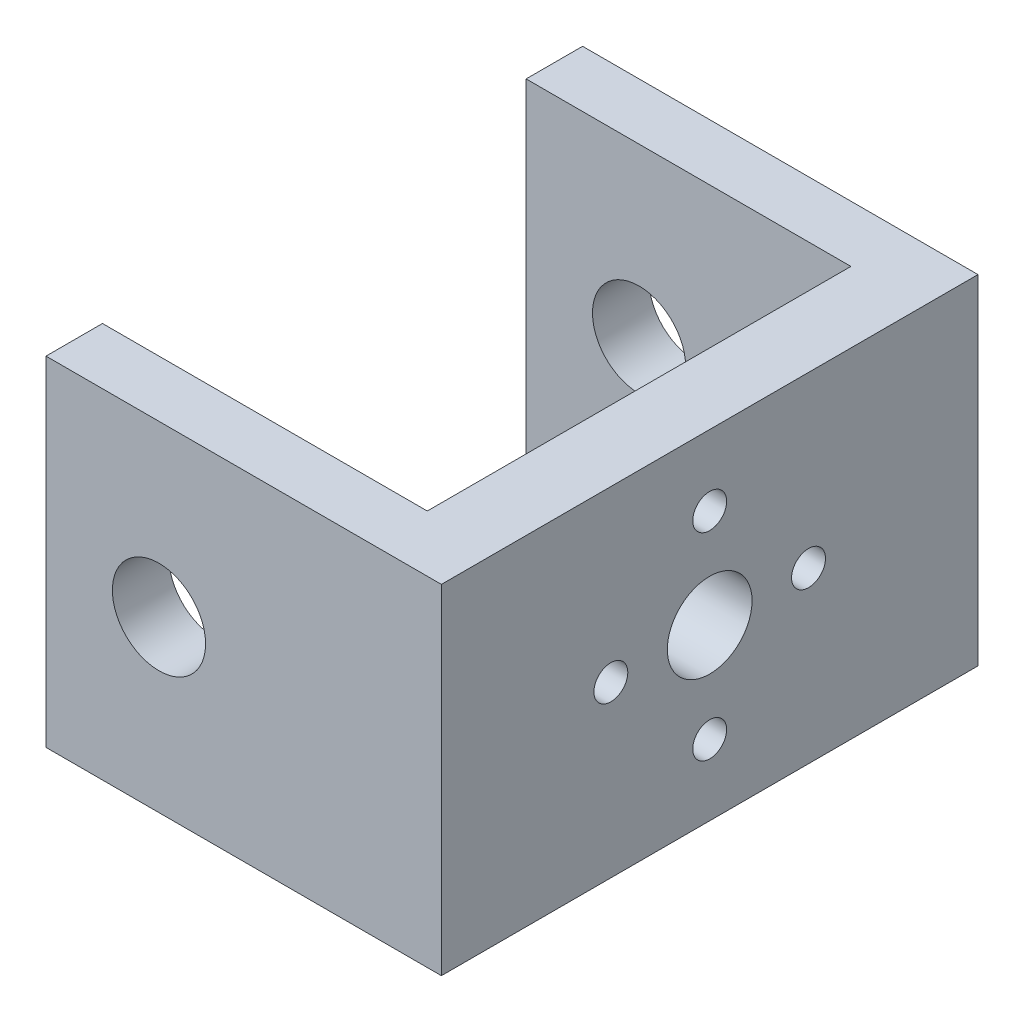
ISO-10303-21;
HEADER;
FILE_DESCRIPTION(('STEP AP214'),'2;1');
FILE_NAME('part.step','',(''),(''),'','','');
FILE_SCHEMA(('AUTOMOTIVE_DESIGN { 1 0 10303 214 1 1 1 1 }'));
ENDSEC;
DATA;
#1=APPLICATION_CONTEXT('core data for automotive mechanical design processes');
#2=APPLICATION_PROTOCOL_DEFINITION('international standard','automotive_design',2000,#1);
#3=PRODUCT_CONTEXT('',#1,'mechanical');
#4=PRODUCT('Part','Part','',(#3));
#5=PRODUCT_RELATED_PRODUCT_CATEGORY('part','',(#4));
#6=PRODUCT_DEFINITION_FORMATION('','',#4);
#7=PRODUCT_DEFINITION_CONTEXT('part definition',#1,'design');
#8=PRODUCT_DEFINITION('design','',#6,#7);
#9=PRODUCT_DEFINITION_SHAPE('','',#8);
#10=(LENGTH_UNIT() NAMED_UNIT(*) SI_UNIT(.MILLI.,.METRE.));
#11=(NAMED_UNIT(*) PLANE_ANGLE_UNIT() SI_UNIT($,.RADIAN.));
#12=(NAMED_UNIT(*) SI_UNIT($,.STERADIAN.) SOLID_ANGLE_UNIT());
#13=UNCERTAINTY_MEASURE_WITH_UNIT(LENGTH_MEASURE(1.E-05),#10,'distance_accuracy_value','');
#14=(GEOMETRIC_REPRESENTATION_CONTEXT(3) GLOBAL_UNCERTAINTY_ASSIGNED_CONTEXT((#13)) GLOBAL_UNIT_ASSIGNED_CONTEXT((#10,
#11,#12)) REPRESENTATION_CONTEXT('',''));
#15=CARTESIAN_POINT('',(0.,0.,0.));
#16=DIRECTION('',(0.,0.,1.));
#17=DIRECTION('',(1.,0.,0.));
#18=AXIS2_PLACEMENT_3D('',#15,#16,#17);
#19=CARTESIAN_POINT('',(0.,0.,-34.));
#20=DIRECTION('',(0.,0.,-1.));
#21=DIRECTION('',(-1.,0.,0.));
#22=AXIS2_PLACEMENT_3D('',#19,#20,#21);
#23=PLANE('',#22);
#24=DIRECTION('',(0.,-1.,0.));
#25=VECTOR('',#24,1.);
#26=CARTESIAN_POINT('',(0.,0.,-34.));
#27=LINE('',#26,#25);
#28=CARTESIAN_POINT('',(0.,24.,-34.));
#29=VERTEX_POINT('',#28);
#30=CARTESIAN_POINT('',(0.,0.,-34.));
#31=VERTEX_POINT('',#30);
#32=EDGE_CURVE('E139',#29,#31,#27,.T.);
#33=ORIENTED_EDGE('',*,*,#32,.F.);
#34=DIRECTION('',(-1.,0.,0.));
#35=VECTOR('',#34,1.);
#36=CARTESIAN_POINT('',(0.,24.,-34.));
#37=LINE('',#36,#35);
#38=CARTESIAN_POINT('',(28.,24.,-34.));
#39=VERTEX_POINT('',#38);
#40=EDGE_CURVE('E135',#39,#29,#37,.T.);
#41=ORIENTED_EDGE('',*,*,#40,.F.);
#42=DIRECTION('',(0.,1.,0.));
#43=VECTOR('',#42,1.);
#44=CARTESIAN_POINT('',(28.,0.,-34.));
#45=LINE('',#44,#43);
#46=CARTESIAN_POINT('',(28.,0.,-34.));
#47=VERTEX_POINT('',#46);
#48=EDGE_CURVE('E188',#47,#39,#45,.T.);
#49=ORIENTED_EDGE('',*,*,#48,.F.);
#50=DIRECTION('',(1.,0.,0.));
#51=VECTOR('',#50,1.);
#52=CARTESIAN_POINT('',(0.,0.,-34.));
#53=LINE('',#52,#51);
#54=EDGE_CURVE('E190',#31,#47,#53,.T.);
#55=ORIENTED_EDGE('',*,*,#54,.F.);
#56=EDGE_LOOP('',(#33,#41,#49,#55));
#57=FACE_BOUND('',#56,.T.);
#58=CARTESIAN_POINT('',(8.,12.,-34.));
#59=DIRECTION('',(0.,0.,1.));
#60=DIRECTION('',(1.,0.,0.));
#61=AXIS2_PLACEMENT_3D('',#58,#59,#60);
#62=CIRCLE('',#61,3.29999999999999);
#63=CARTESIAN_POINT('',(11.3,12.,-34.));
#64=VERTEX_POINT('',#63);
#65=EDGE_CURVE('E211',#64,#64,#62,.T.);
#66=ORIENTED_EDGE('',*,*,#65,.T.);
#67=EDGE_LOOP('',(#66));
#68=FACE_BOUND('',#67,.T.);
#69=ADVANCED_FACE('F39',(#57,#68),#23,.T.);
#70=CARTESIAN_POINT('',(0.,0.,4.));
#71=DIRECTION('',(1.,0.,0.));
#72=DIRECTION('',(0.,0.,-1.));
#73=AXIS2_PLACEMENT_3D('',#70,#71,#72);
#74=PLANE('',#73);
#75=DIRECTION('',(0.,-1.,0.));
#76=VECTOR('',#75,1.);
#77=CARTESIAN_POINT('',(0.,0.,0.));
#78=LINE('',#77,#76);
#79=CARTESIAN_POINT('',(0.,24.,0.));
#80=VERTEX_POINT('',#79);
#81=CARTESIAN_POINT('',(0.,0.,0.));
#82=VERTEX_POINT('',#81);
#83=EDGE_CURVE('E157',#80,#82,#78,.T.);
#84=ORIENTED_EDGE('',*,*,#83,.T.);
#85=DIRECTION('',(0.,0.,-1.));
#86=VECTOR('',#85,1.);
#87=CARTESIAN_POINT('',(0.,0.,4.));
#88=LINE('',#87,#86);
#89=CARTESIAN_POINT('',(0.,0.,4.));
#90=VERTEX_POINT('',#89);
#91=EDGE_CURVE('E11',#90,#82,#88,.T.);
#92=ORIENTED_EDGE('',*,*,#91,.F.);
#93=DIRECTION('',(0.,-1.,0.));
#94=VECTOR('',#93,1.);
#95=CARTESIAN_POINT('',(0.,0.,4.));
#96=LINE('',#95,#94);
#97=CARTESIAN_POINT('',(0.,24.,4.));
#98=VERTEX_POINT('',#97);
#99=EDGE_CURVE('E158',#98,#90,#96,.T.);
#100=ORIENTED_EDGE('',*,*,#99,.F.);
#101=DIRECTION('',(0.,0.,-1.));
#102=VECTOR('',#101,1.);
#103=CARTESIAN_POINT('',(0.,24.,4.));
#104=LINE('',#103,#102);
#105=EDGE_CURVE('E168',#98,#80,#104,.T.);
#106=ORIENTED_EDGE('',*,*,#105,.T.);
#107=EDGE_LOOP('',(#84,#92,#100,#106));
#108=FACE_BOUND('',#107,.T.);
#109=ADVANCED_FACE('F41',(#108),#74,.F.);
#110=CARTESIAN_POINT('',(0.,0.,4.));
#111=DIRECTION('',(0.,1.,0.));
#112=DIRECTION('',(0.,0.,1.));
#113=AXIS2_PLACEMENT_3D('',#110,#111,#112);
#114=PLANE('',#113);
#115=DIRECTION('',(1.,0.,0.));
#116=VECTOR('',#115,1.);
#117=CARTESIAN_POINT('',(0.,0.,0.));
#118=LINE('',#117,#116);
#119=CARTESIAN_POINT('',(23.,0.,0.));
#120=VERTEX_POINT('',#119);
#121=EDGE_CURVE('E172',#82,#120,#118,.T.);
#122=ORIENTED_EDGE('',*,*,#121,.T.);
#123=DIRECTION('',(0.,0.,1.));
#124=VECTOR('',#123,1.);
#125=CARTESIAN_POINT('',(23.,0.,-30.));
#126=LINE('',#125,#124);
#127=CARTESIAN_POINT('',(23.,0.,-30.));
#128=VERTEX_POINT('',#127);
#129=EDGE_CURVE('E120',#128,#120,#126,.T.);
#130=ORIENTED_EDGE('',*,*,#129,.F.);
#131=DIRECTION('',(1.,0.,0.));
#132=VECTOR('',#131,1.);
#133=CARTESIAN_POINT('',(0.,0.,-30.));
#134=LINE('',#133,#132);
#135=CARTESIAN_POINT('',(0.,0.,-30.));
#136=VERTEX_POINT('',#135);
#137=EDGE_CURVE('E112',#136,#128,#134,.T.);
#138=ORIENTED_EDGE('',*,*,#137,.F.);
#139=DIRECTION('',(0.,0.,-1.));
#140=VECTOR('',#139,1.);
#141=CARTESIAN_POINT('',(0.,0.,-30.));
#142=LINE('',#141,#140);
#143=EDGE_CURVE('E117',#136,#31,#142,.T.);
#144=ORIENTED_EDGE('',*,*,#143,.T.);
#145=ORIENTED_EDGE('',*,*,#54,.T.);
#146=DIRECTION('',(0.,0.,-1.));
#147=VECTOR('',#146,1.);
#148=CARTESIAN_POINT('',(28.,0.,4.));
#149=LINE('',#148,#147);
#150=CARTESIAN_POINT('',(28.,0.,4.));
#151=VERTEX_POINT('',#150);
#152=EDGE_CURVE('E48',#151,#47,#149,.T.);
#153=ORIENTED_EDGE('',*,*,#152,.F.);
#154=DIRECTION('',(1.,0.,0.));
#155=VECTOR('',#154,1.);
#156=CARTESIAN_POINT('',(0.,0.,4.));
#157=LINE('',#156,#155);
#158=EDGE_CURVE('E84',#90,#151,#157,.T.);
#159=ORIENTED_EDGE('',*,*,#158,.F.);
#160=ORIENTED_EDGE('',*,*,#91,.T.);
#161=EDGE_LOOP('',(#122,#130,#138,#144,#145,#153,#159,#160));
#162=FACE_BOUND('',#161,.T.);
#163=ADVANCED_FACE('F114',(#162),#114,.F.);
#164=CARTESIAN_POINT('',(28.,0.,4.));
#165=DIRECTION('',(-1.,0.,0.));
#166=DIRECTION('',(0.,0.,1.));
#167=AXIS2_PLACEMENT_3D('',#164,#165,#166);
#168=PLANE('',#167);
#169=CARTESIAN_POINT('',(28.,19.,-14.9999999999999));
#170=DIRECTION('',(1.,0.,0.));
#171=DIRECTION('',(0.,-1.,0.));
#172=AXIS2_PLACEMENT_3D('',#169,#170,#171);
#173=CIRCLE('',#172,1.2);
#174=CARTESIAN_POINT('',(28.,17.8,-14.9999999999999));
#175=VERTEX_POINT('',#174);
#176=EDGE_CURVE('E241',#175,#175,#173,.T.);
#177=ORIENTED_EDGE('',*,*,#176,.F.);
#178=EDGE_LOOP('',(#177));
#179=FACE_BOUND('',#178,.T.);
#180=CARTESIAN_POINT('',(28.,5.,-15.));
#181=DIRECTION('',(1.,0.,0.));
#182=DIRECTION('',(0.,1.,0.));
#183=AXIS2_PLACEMENT_3D('',#180,#181,#182);
#184=CIRCLE('',#183,1.2);
#185=CARTESIAN_POINT('',(28.,6.2,-15.));
#186=VERTEX_POINT('',#185);
#187=EDGE_CURVE('E248',#186,#186,#184,.T.);
#188=ORIENTED_EDGE('',*,*,#187,.F.);
#189=EDGE_LOOP('',(#188));
#190=FACE_BOUND('',#189,.T.);
#191=CARTESIAN_POINT('',(28.,12.,-22.));
#192=DIRECTION('',(1.,0.,0.));
#193=DIRECTION('',(0.,0.,1.));
#194=AXIS2_PLACEMENT_3D('',#191,#192,#193);
#195=CIRCLE('',#194,1.2);
#196=CARTESIAN_POINT('',(28.,12.,-20.8));
#197=VERTEX_POINT('',#196);
#198=EDGE_CURVE('E240',#197,#197,#195,.T.);
#199=ORIENTED_EDGE('',*,*,#198,.F.);
#200=EDGE_LOOP('',(#199));
#201=FACE_BOUND('',#200,.T.);
#202=CARTESIAN_POINT('',(28.,12.,-15.));
#203=DIRECTION('',(1.,0.,0.));
#204=DIRECTION('',(0.,0.,-1.));
#205=AXIS2_PLACEMENT_3D('',#202,#203,#204);
#206=CIRCLE('',#205,3.);
#207=CARTESIAN_POINT('',(28.,12.,-18.));
#208=VERTEX_POINT('',#207);
#209=EDGE_CURVE('E224',#208,#208,#206,.T.);
#210=ORIENTED_EDGE('',*,*,#209,.F.);
#211=EDGE_LOOP('',(#210));
#212=FACE_BOUND('',#211,.T.);
#213=CARTESIAN_POINT('',(28.,12.,-8.));
#214=DIRECTION('',(1.,0.,0.));
#215=DIRECTION('',(0.,0.,-1.));
#216=AXIS2_PLACEMENT_3D('',#213,#214,#215);
#217=CIRCLE('',#216,1.2);
#218=CARTESIAN_POINT('',(28.,12.,-9.2));
#219=VERTEX_POINT('',#218);
#220=EDGE_CURVE('E225',#219,#219,#217,.T.);
#221=ORIENTED_EDGE('',*,*,#220,.F.);
#222=EDGE_LOOP('',(#221));
#223=FACE_BOUND('',#222,.T.);
#224=ORIENTED_EDGE('',*,*,#152,.T.);
#225=ORIENTED_EDGE('',*,*,#48,.T.);
#226=DIRECTION('',(0.,0.,-1.));
#227=VECTOR('',#226,1.);
#228=CARTESIAN_POINT('',(28.,24.,4.));
#229=LINE('',#228,#227);
#230=CARTESIAN_POINT('',(28.,24.,4.));
#231=VERTEX_POINT('',#230);
#232=EDGE_CURVE('E179',#231,#39,#229,.T.);
#233=ORIENTED_EDGE('',*,*,#232,.F.);
#234=DIRECTION('',(0.,1.,0.));
#235=VECTOR('',#234,1.);
#236=CARTESIAN_POINT('',(28.,0.,4.));
#237=LINE('',#236,#235);
#238=EDGE_CURVE('E163',#151,#231,#237,.T.);
#239=ORIENTED_EDGE('',*,*,#238,.F.);
#240=EDGE_LOOP('',(#224,#225,#233,#239));
#241=FACE_BOUND('',#240,.T.);
#242=ADVANCED_FACE('F185',(#179,#190,#201,#212,#223,#241),#168,.F.);
#243=CARTESIAN_POINT('',(0.,24.,4.));
#244=DIRECTION('',(0.,-1.,0.));
#245=DIRECTION('',(0.,0.,-1.));
#246=AXIS2_PLACEMENT_3D('',#243,#244,#245);
#247=PLANE('',#246);
#248=ORIENTED_EDGE('',*,*,#232,.T.);
#249=ORIENTED_EDGE('',*,*,#40,.T.);
#250=DIRECTION('',(0.,0.,-1.));
#251=VECTOR('',#250,1.);
#252=CARTESIAN_POINT('',(0.,24.,-30.));
#253=LINE('',#252,#251);
#254=CARTESIAN_POINT('',(0.,24.,-30.));
#255=VERTEX_POINT('',#254);
#256=EDGE_CURVE('E141',#255,#29,#253,.T.);
#257=ORIENTED_EDGE('',*,*,#256,.F.);
#258=DIRECTION('',(-1.,0.,0.));
#259=VECTOR('',#258,1.);
#260=CARTESIAN_POINT('',(0.,24.,-30.));
#261=LINE('',#260,#259);
#262=CARTESIAN_POINT('',(23.,24.,-30.));
#263=VERTEX_POINT('',#262);
#264=EDGE_CURVE('E125',#263,#255,#261,.T.);
#265=ORIENTED_EDGE('',*,*,#264,.F.);
#266=DIRECTION('',(0.,0.,1.));
#267=VECTOR('',#266,1.);
#268=CARTESIAN_POINT('',(23.,24.,-30.));
#269=LINE('',#268,#267);
#270=CARTESIAN_POINT('',(23.,24.,0.));
#271=VERTEX_POINT('',#270);
#272=EDGE_CURVE('E151',#263,#271,#269,.T.);
#273=ORIENTED_EDGE('',*,*,#272,.T.);
#274=DIRECTION('',(-1.,0.,0.));
#275=VECTOR('',#274,1.);
#276=CARTESIAN_POINT('',(0.,24.,0.));
#277=LINE('',#276,#275);
#278=EDGE_CURVE('E77',#271,#80,#277,.T.);
#279=ORIENTED_EDGE('',*,*,#278,.T.);
#280=ORIENTED_EDGE('',*,*,#105,.F.);
#281=DIRECTION('',(-1.,0.,0.));
#282=VECTOR('',#281,1.);
#283=CARTESIAN_POINT('',(0.,24.,4.));
#284=LINE('',#283,#282);
#285=EDGE_CURVE('E64',#231,#98,#284,.T.);
#286=ORIENTED_EDGE('',*,*,#285,.F.);
#287=EDGE_LOOP('',(#248,#249,#257,#265,#273,#279,#280,#286));
#288=FACE_BOUND('',#287,.T.);
#289=ADVANCED_FACE('F265',(#288),#247,.F.);
#290=CARTESIAN_POINT('',(0.,0.,4.));
#291=DIRECTION('',(0.,0.,-1.));
#292=DIRECTION('',(-1.,0.,0.));
#293=AXIS2_PLACEMENT_3D('',#290,#291,#292);
#294=PLANE('',#293);
#295=CARTESIAN_POINT('',(8.,12.,4.));
#296=DIRECTION('',(0.,0.,1.));
#297=DIRECTION('',(1.,0.,0.));
#298=AXIS2_PLACEMENT_3D('',#295,#296,#297);
#299=CIRCLE('',#298,3.29999999999999);
#300=CARTESIAN_POINT('',(11.3,12.,4.));
#301=VERTEX_POINT('',#300);
#302=EDGE_CURVE('E215',#301,#301,#299,.T.);
#303=ORIENTED_EDGE('',*,*,#302,.F.);
#304=EDGE_LOOP('',(#303));
#305=FACE_BOUND('',#304,.T.);
#306=ORIENTED_EDGE('',*,*,#99,.T.);
#307=ORIENTED_EDGE('',*,*,#158,.T.);
#308=ORIENTED_EDGE('',*,*,#238,.T.);
#309=ORIENTED_EDGE('',*,*,#285,.T.);
#310=EDGE_LOOP('',(#306,#307,#308,#309));
#311=FACE_BOUND('',#310,.T.);
#312=ADVANCED_FACE('F290',(#305,#311),#294,.F.);
#313=CARTESIAN_POINT('',(0.,0.,0.));
#314=DIRECTION('',(0.,0.,-1.));
#315=DIRECTION('',(-1.,0.,0.));
#316=AXIS2_PLACEMENT_3D('',#313,#314,#315);
#317=PLANE('',#316);
#318=CARTESIAN_POINT('',(8.,12.,0.));
#319=DIRECTION('',(0.,0.,-1.));
#320=DIRECTION('',(-1.,0.,0.));
#321=AXIS2_PLACEMENT_3D('',#318,#319,#320);
#322=CIRCLE('',#321,3.29999999999999);
#323=CARTESIAN_POINT('',(4.70000000000001,12.,0.));
#324=VERTEX_POINT('',#323);
#325=EDGE_CURVE('E201',#324,#324,#322,.T.);
#326=ORIENTED_EDGE('',*,*,#325,.F.);
#327=EDGE_LOOP('',(#326));
#328=FACE_BOUND('',#327,.T.);
#329=DIRECTION('',(0.,1.,0.));
#330=VECTOR('',#329,1.);
#331=CARTESIAN_POINT('',(23.,24.,0.));
#332=LINE('',#331,#330);
#333=EDGE_CURVE('E55',#120,#271,#332,.T.);
#334=ORIENTED_EDGE('',*,*,#333,.F.);
#335=ORIENTED_EDGE('',*,*,#121,.F.);
#336=ORIENTED_EDGE('',*,*,#83,.F.);
#337=ORIENTED_EDGE('',*,*,#278,.F.);
#338=EDGE_LOOP('',(#334,#335,#336,#337));
#339=FACE_BOUND('',#338,.T.);
#340=ADVANCED_FACE('F283',(#328,#339),#317,.T.);
#341=CARTESIAN_POINT('',(23.,24.,-30.));
#342=DIRECTION('',(1.,0.,0.));
#343=DIRECTION('',(0.,1.,0.));
#344=AXIS2_PLACEMENT_3D('',#341,#342,#343);
#345=PLANE('',#344);
#346=CARTESIAN_POINT('',(23.,19.,-14.9999999999999));
#347=DIRECTION('',(1.,0.,0.));
#348=DIRECTION('',(0.,1.,0.));
#349=AXIS2_PLACEMENT_3D('',#346,#347,#348);
#350=CIRCLE('',#349,1.2);
#351=CARTESIAN_POINT('',(23.,20.2,-14.9999999999999));
#352=VERTEX_POINT('',#351);
#353=EDGE_CURVE('E236',#352,#352,#350,.F.);
#354=ORIENTED_EDGE('',*,*,#353,.F.);
#355=EDGE_LOOP('',(#354));
#356=FACE_BOUND('',#355,.T.);
#357=CARTESIAN_POINT('',(23.,5.,-15.));
#358=DIRECTION('',(1.,0.,0.));
#359=DIRECTION('',(0.,1.,0.));
#360=AXIS2_PLACEMENT_3D('',#357,#358,#359);
#361=CIRCLE('',#360,1.2);
#362=CARTESIAN_POINT('',(23.,6.2,-15.));
#363=VERTEX_POINT('',#362);
#364=EDGE_CURVE('E229',#363,#363,#361,.F.);
#365=ORIENTED_EDGE('',*,*,#364,.F.);
#366=EDGE_LOOP('',(#365));
#367=FACE_BOUND('',#366,.T.);
#368=CARTESIAN_POINT('',(23.,12.,-22.));
#369=DIRECTION('',(1.,0.,0.));
#370=DIRECTION('',(0.,1.,0.));
#371=AXIS2_PLACEMENT_3D('',#368,#369,#370);
#372=CIRCLE('',#371,1.2);
#373=CARTESIAN_POINT('',(23.,13.2,-22.));
#374=VERTEX_POINT('',#373);
#375=EDGE_CURVE('E252',#374,#374,#372,.F.);
#376=ORIENTED_EDGE('',*,*,#375,.F.);
#377=EDGE_LOOP('',(#376));
#378=FACE_BOUND('',#377,.T.);
#379=CARTESIAN_POINT('',(23.,12.,-15.));
#380=DIRECTION('',(1.,0.,0.));
#381=DIRECTION('',(0.,1.,0.));
#382=AXIS2_PLACEMENT_3D('',#379,#380,#381);
#383=CIRCLE('',#382,3.);
#384=CARTESIAN_POINT('',(23.,15.,-15.));
#385=VERTEX_POINT('',#384);
#386=EDGE_CURVE('E219',#385,#385,#383,.F.);
#387=ORIENTED_EDGE('',*,*,#386,.F.);
#388=EDGE_LOOP('',(#387));
#389=FACE_BOUND('',#388,.T.);
#390=CARTESIAN_POINT('',(23.,12.,-8.));
#391=DIRECTION('',(1.,0.,0.));
#392=DIRECTION('',(0.,1.,0.));
#393=AXIS2_PLACEMENT_3D('',#390,#391,#392);
#394=CIRCLE('',#393,1.2);
#395=CARTESIAN_POINT('',(23.,13.2,-8.));
#396=VERTEX_POINT('',#395);
#397=EDGE_CURVE('E220',#396,#396,#394,.F.);
#398=ORIENTED_EDGE('',*,*,#397,.F.);
#399=EDGE_LOOP('',(#398));
#400=FACE_BOUND('',#399,.T.);
#401=ORIENTED_EDGE('',*,*,#333,.T.);
#402=ORIENTED_EDGE('',*,*,#272,.F.);
#403=DIRECTION('',(0.,1.,0.));
#404=VECTOR('',#403,1.);
#405=CARTESIAN_POINT('',(23.,24.,-30.));
#406=LINE('',#405,#404);
#407=EDGE_CURVE('E145',#128,#263,#406,.T.);
#408=ORIENTED_EDGE('',*,*,#407,.F.);
#409=ORIENTED_EDGE('',*,*,#129,.T.);
#410=EDGE_LOOP('',(#401,#402,#408,#409));
#411=FACE_BOUND('',#410,.T.);
#412=ADVANCED_FACE('F280',(#356,#367,#378,#389,#400,#411),#345,.F.);
#413=CARTESIAN_POINT('',(0.,0.,-30.));
#414=DIRECTION('',(0.,0.,-1.));
#415=DIRECTION('',(-1.,0.,0.));
#416=AXIS2_PLACEMENT_3D('',#413,#414,#415);
#417=PLANE('',#416);
#418=CARTESIAN_POINT('',(8.,12.,-30.));
#419=DIRECTION('',(0.,0.,-1.));
#420=DIRECTION('',(-1.,0.,0.));
#421=AXIS2_PLACEMENT_3D('',#418,#419,#420);
#422=CIRCLE('',#421,3.29999999999999);
#423=CARTESIAN_POINT('',(4.70000000000001,12.,-30.));
#424=VERTEX_POINT('',#423);
#425=EDGE_CURVE('E207',#424,#424,#422,.T.);
#426=ORIENTED_EDGE('',*,*,#425,.T.);
#427=EDGE_LOOP('',(#426));
#428=FACE_BOUND('',#427,.T.);
#429=ORIENTED_EDGE('',*,*,#137,.T.);
#430=ORIENTED_EDGE('',*,*,#407,.T.);
#431=ORIENTED_EDGE('',*,*,#264,.T.);
#432=DIRECTION('',(0.,-1.,0.));
#433=VECTOR('',#432,1.);
#434=CARTESIAN_POINT('',(0.,0.,-30.));
#435=LINE('',#434,#433);
#436=EDGE_CURVE('E126',#255,#136,#435,.T.);
#437=ORIENTED_EDGE('',*,*,#436,.T.);
#438=EDGE_LOOP('',(#429,#430,#431,#437));
#439=FACE_BOUND('',#438,.T.);
#440=ADVANCED_FACE('F129',(#428,#439),#417,.F.);
#441=CARTESIAN_POINT('',(0.,0.,-30.));
#442=DIRECTION('',(1.,0.,0.));
#443=DIRECTION('',(0.,0.,-1.));
#444=AXIS2_PLACEMENT_3D('',#441,#442,#443);
#445=PLANE('',#444);
#446=ORIENTED_EDGE('',*,*,#32,.T.);
#447=ORIENTED_EDGE('',*,*,#143,.F.);
#448=ORIENTED_EDGE('',*,*,#436,.F.);
#449=ORIENTED_EDGE('',*,*,#256,.T.);
#450=EDGE_LOOP('',(#446,#447,#448,#449));
#451=FACE_BOUND('',#450,.T.);
#452=ADVANCED_FACE('F137',(#451),#445,.F.);
#453=CARTESIAN_POINT('',(8.,12.,4.));
#454=DIRECTION('',(0.,0.,1.));
#455=DIRECTION('',(1.,0.,0.));
#456=AXIS2_PLACEMENT_3D('',#453,#454,#455);
#457=CYLINDRICAL_SURFACE('',#456,3.29999999999999);
#458=ORIENTED_EDGE('',*,*,#65,.F.);
#459=EDGE_LOOP('',(#458));
#460=FACE_BOUND('',#459,.T.);
#461=ORIENTED_EDGE('',*,*,#425,.F.);
#462=EDGE_LOOP('',(#461));
#463=FACE_BOUND('',#462,.T.);
#464=ADVANCED_FACE('F311',(#460,#463),#457,.F.);
#465=ORIENTED_EDGE('',*,*,#325,.T.);
#466=EDGE_LOOP('',(#465));
#467=FACE_BOUND('',#466,.T.);
#468=ORIENTED_EDGE('',*,*,#302,.T.);
#469=EDGE_LOOP('',(#468));
#470=FACE_BOUND('',#469,.T.);
#471=ADVANCED_FACE('F276',(#467,#470),#457,.F.);
#472=CARTESIAN_POINT('',(-0.001000000000001,12.,-8.));
#473=DIRECTION('',(1.,0.,0.));
#474=DIRECTION('',(0.,0.,-1.));
#475=AXIS2_PLACEMENT_3D('',#472,#473,#474);
#476=CYLINDRICAL_SURFACE('',#475,1.2);
#477=ORIENTED_EDGE('',*,*,#220,.T.);
#478=EDGE_LOOP('',(#477));
#479=FACE_BOUND('',#478,.T.);
#480=ORIENTED_EDGE('',*,*,#397,.T.);
#481=EDGE_LOOP('',(#480));
#482=FACE_BOUND('',#481,.T.);
#483=ADVANCED_FACE('F272',(#479,#482),#476,.F.);
#484=CARTESIAN_POINT('',(-0.001000000000001,12.,-15.));
#485=DIRECTION('',(1.,0.,0.));
#486=DIRECTION('',(0.,0.,-1.));
#487=AXIS2_PLACEMENT_3D('',#484,#485,#486);
#488=CYLINDRICAL_SURFACE('',#487,3.);
#489=ORIENTED_EDGE('',*,*,#209,.T.);
#490=EDGE_LOOP('',(#489));
#491=FACE_BOUND('',#490,.T.);
#492=ORIENTED_EDGE('',*,*,#386,.T.);
#493=EDGE_LOOP('',(#492));
#494=FACE_BOUND('',#493,.T.);
#495=ADVANCED_FACE('F275',(#491,#494),#488,.F.);
#496=CARTESIAN_POINT('',(-0.001000000000001,12.,-22.));
#497=DIRECTION('',(1.,0.,0.));
#498=DIRECTION('',(0.,0.,-1.));
#499=AXIS2_PLACEMENT_3D('',#496,#497,#498);
#500=CYLINDRICAL_SURFACE('',#499,1.2);
#501=ORIENTED_EDGE('',*,*,#198,.T.);
#502=EDGE_LOOP('',(#501));
#503=FACE_BOUND('',#502,.T.);
#504=ORIENTED_EDGE('',*,*,#375,.T.);
#505=EDGE_LOOP('',(#504));
#506=FACE_BOUND('',#505,.T.);
#507=ADVANCED_FACE('F260',(#503,#506),#500,.F.);
#508=CARTESIAN_POINT('',(-0.001000000000001,5.,-15.));
#509=DIRECTION('',(1.,0.,0.));
#510=DIRECTION('',(0.,0.,-1.));
#511=AXIS2_PLACEMENT_3D('',#508,#509,#510);
#512=CYLINDRICAL_SURFACE('',#511,1.2);
#513=ORIENTED_EDGE('',*,*,#187,.T.);
#514=EDGE_LOOP('',(#513));
#515=FACE_BOUND('',#514,.T.);
#516=ORIENTED_EDGE('',*,*,#364,.T.);
#517=EDGE_LOOP('',(#516));
#518=FACE_BOUND('',#517,.T.);
#519=ADVANCED_FACE('F428',(#515,#518),#512,.F.);
#520=CARTESIAN_POINT('',(-0.001000000000001,19.,-14.9999999999999));
#521=DIRECTION('',(1.,0.,0.));
#522=DIRECTION('',(0.,0.,-1.));
#523=AXIS2_PLACEMENT_3D('',#520,#521,#522);
#524=CYLINDRICAL_SURFACE('',#523,1.2);
#525=ORIENTED_EDGE('',*,*,#176,.T.);
#526=EDGE_LOOP('',(#525));
#527=FACE_BOUND('',#526,.T.);
#528=ORIENTED_EDGE('',*,*,#353,.T.);
#529=EDGE_LOOP('',(#528));
#530=FACE_BOUND('',#529,.T.);
#531=ADVANCED_FACE('F425',(#527,#530),#524,.F.);
#532=CLOSED_SHELL('',(#69,#109,#163,#242,#289,#312,#340,#412,#440,#452,#464,#471,#483,#495,#507,
#519,#531));
#533=MANIFOLD_SOLID_BREP('B2',#532);
#534=ADVANCED_BREP_SHAPE_REPRESENTATION('',(#18,#533),#14);
#535=SHAPE_DEFINITION_REPRESENTATION(#9,#534);
ENDSEC;
END-ISO-10303-21;
